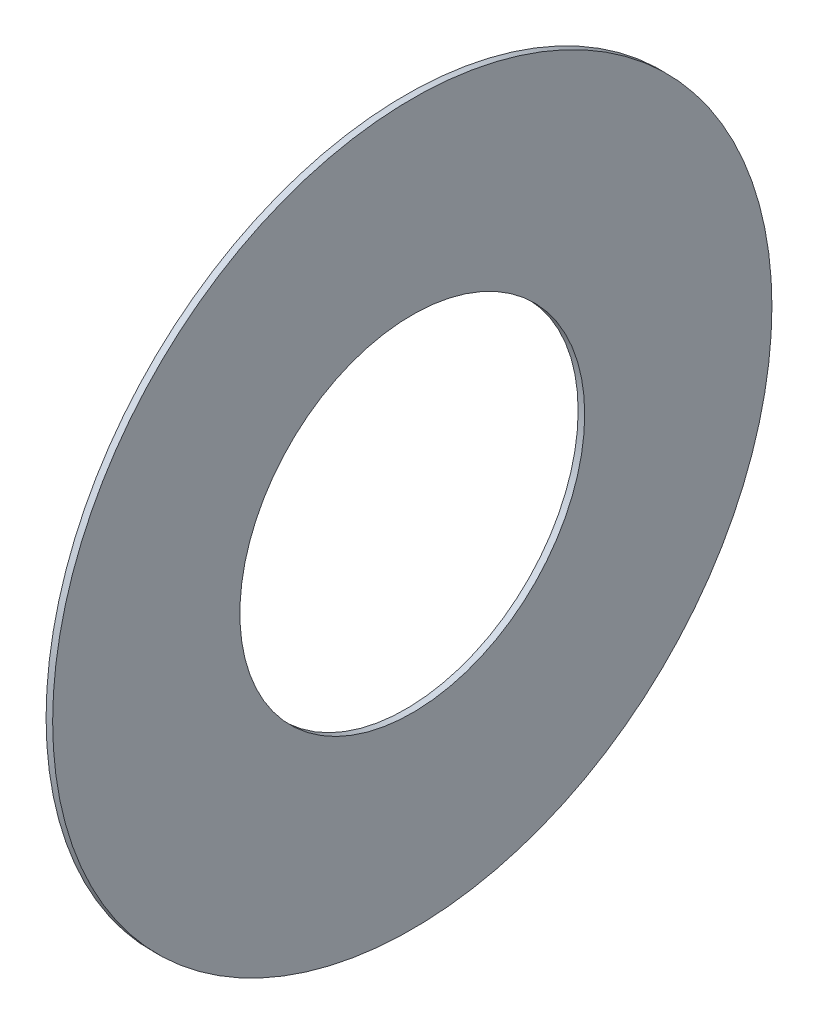
ISO-10303-21;
HEADER;
FILE_DESCRIPTION(('STEP AP214'),'2;1');
FILE_NAME('part.step','',(''),(''),'','','');
FILE_SCHEMA(('AUTOMOTIVE_DESIGN { 1 0 10303 214 1 1 1 1 }'));
ENDSEC;
DATA;
#1=APPLICATION_CONTEXT('core data for automotive mechanical design processes');
#2=APPLICATION_PROTOCOL_DEFINITION('international standard','automotive_design',2000,#1);
#3=PRODUCT_CONTEXT('',#1,'mechanical');
#4=PRODUCT('Part','Part','',(#3));
#5=PRODUCT_RELATED_PRODUCT_CATEGORY('part','',(#4));
#6=PRODUCT_DEFINITION_FORMATION('','',#4);
#7=PRODUCT_DEFINITION_CONTEXT('part definition',#1,'design');
#8=PRODUCT_DEFINITION('design','',#6,#7);
#9=PRODUCT_DEFINITION_SHAPE('','',#8);
#10=(LENGTH_UNIT() NAMED_UNIT(*) SI_UNIT(.MILLI.,.METRE.));
#11=(NAMED_UNIT(*) PLANE_ANGLE_UNIT() SI_UNIT($,.RADIAN.));
#12=(NAMED_UNIT(*) SI_UNIT($,.STERADIAN.) SOLID_ANGLE_UNIT());
#13=UNCERTAINTY_MEASURE_WITH_UNIT(LENGTH_MEASURE(1.E-05),#10,'distance_accuracy_value','');
#14=(GEOMETRIC_REPRESENTATION_CONTEXT(3) GLOBAL_UNCERTAINTY_ASSIGNED_CONTEXT((#13)) GLOBAL_UNIT_ASSIGNED_CONTEXT((#10,
#11,#12)) REPRESENTATION_CONTEXT('',''));
#15=CARTESIAN_POINT('',(0.,0.,0.));
#16=DIRECTION('',(0.,0.,1.));
#17=DIRECTION('',(1.,0.,0.));
#18=AXIS2_PLACEMENT_3D('',#15,#16,#17);
#19=CARTESIAN_POINT('',(0.,5.25,0.));
#20=DIRECTION('',(1.,0.,0.));
#21=DIRECTION('',(0.,0.,-1.));
#22=AXIS2_PLACEMENT_3D('',#19,#20,#21);
#23=PLANE('',#22);
#24=CARTESIAN_POINT('',(0.,0.,0.));
#25=DIRECTION('',(1.,0.,0.));
#26=DIRECTION('',(0.,0.,-1.));
#27=AXIS2_PLACEMENT_3D('',#24,#25,#26);
#28=CIRCLE('',#27,10.95);
#29=CARTESIAN_POINT('',(0.,0.,-10.95));
#30=VERTEX_POINT('',#29);
#31=EDGE_CURVE('E10',#30,#30,#28,.T.);
#32=ORIENTED_EDGE('',*,*,#31,.T.);
#33=EDGE_LOOP('',(#32));
#34=FACE_BOUND('',#33,.T.);
#35=CARTESIAN_POINT('',(0.,0.,0.));
#36=DIRECTION('',(1.,0.,0.));
#37=DIRECTION('',(0.,0.,-1.));
#38=AXIS2_PLACEMENT_3D('',#35,#36,#37);
#39=CIRCLE('',#38,5.25);
#40=CARTESIAN_POINT('',(0.,0.,-5.25));
#41=VERTEX_POINT('',#40);
#42=EDGE_CURVE('E47',#41,#41,#39,.T.);
#43=ORIENTED_EDGE('',*,*,#42,.F.);
#44=EDGE_LOOP('',(#43));
#45=FACE_BOUND('',#44,.T.);
#46=ADVANCED_FACE('F33',(#34,#45),#23,.T.);
#47=CARTESIAN_POINT('',(-0.2,0.,0.));
#48=DIRECTION('',(1.,0.,0.));
#49=DIRECTION('',(0.,0.,-1.));
#50=AXIS2_PLACEMENT_3D('',#47,#48,#49);
#51=CYLINDRICAL_SURFACE('',#50,10.95);
#52=CARTESIAN_POINT('',(-0.2,0.,0.));
#53=DIRECTION('',(1.,0.,0.));
#54=DIRECTION('',(0.,0.,-1.));
#55=AXIS2_PLACEMENT_3D('',#52,#53,#54);
#56=CIRCLE('',#55,10.95);
#57=CARTESIAN_POINT('',(-0.2,0.,-10.95));
#58=VERTEX_POINT('',#57);
#59=EDGE_CURVE('E39',#58,#58,#56,.T.);
#60=ORIENTED_EDGE('',*,*,#59,.T.);
#61=EDGE_LOOP('',(#60));
#62=FACE_BOUND('',#61,.T.);
#63=ORIENTED_EDGE('',*,*,#31,.F.);
#64=EDGE_LOOP('',(#63));
#65=FACE_BOUND('',#64,.T.);
#66=ADVANCED_FACE('F57',(#62,#65),#51,.T.);
#67=CARTESIAN_POINT('',(-0.2,10.95,0.));
#68=DIRECTION('',(-1.,0.,0.));
#69=DIRECTION('',(0.,0.,1.));
#70=AXIS2_PLACEMENT_3D('',#67,#68,#69);
#71=PLANE('',#70);
#72=CARTESIAN_POINT('',(-0.2,0.,0.));
#73=DIRECTION('',(1.,0.,0.));
#74=DIRECTION('',(0.,0.,-1.));
#75=AXIS2_PLACEMENT_3D('',#72,#73,#74);
#76=CIRCLE('',#75,5.25);
#77=CARTESIAN_POINT('',(-0.2,0.,-5.25));
#78=VERTEX_POINT('',#77);
#79=EDGE_CURVE('E43',#78,#78,#76,.T.);
#80=ORIENTED_EDGE('',*,*,#79,.T.);
#81=EDGE_LOOP('',(#80));
#82=FACE_BOUND('',#81,.T.);
#83=ORIENTED_EDGE('',*,*,#59,.F.);
#84=EDGE_LOOP('',(#83));
#85=FACE_BOUND('',#84,.T.);
#86=ADVANCED_FACE('F61',(#82,#85),#71,.T.);
#87=CARTESIAN_POINT('',(-0.2,0.,0.));
#88=DIRECTION('',(1.,0.,0.));
#89=DIRECTION('',(0.,0.,-1.));
#90=AXIS2_PLACEMENT_3D('',#87,#88,#89);
#91=CYLINDRICAL_SURFACE('',#90,5.25);
#92=ORIENTED_EDGE('',*,*,#42,.T.);
#93=EDGE_LOOP('',(#92));
#94=FACE_BOUND('',#93,.T.);
#95=ORIENTED_EDGE('',*,*,#79,.F.);
#96=EDGE_LOOP('',(#95));
#97=FACE_BOUND('',#96,.T.);
#98=ADVANCED_FACE('F53',(#94,#97),#91,.F.);
#99=CLOSED_SHELL('',(#46,#66,#86,#98));
#100=MANIFOLD_SOLID_BREP('B2',#99);
#101=ADVANCED_BREP_SHAPE_REPRESENTATION('',(#18,#100),#14);
#102=SHAPE_DEFINITION_REPRESENTATION(#9,#101);
ENDSEC;
END-ISO-10303-21;
